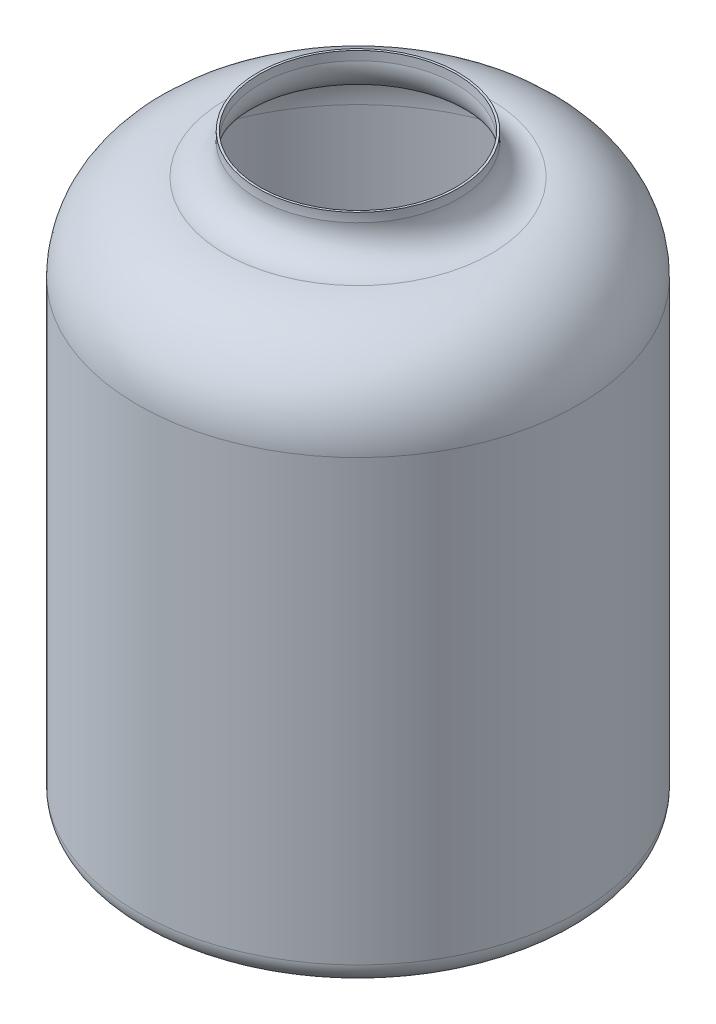
ISO-10303-21;
HEADER;
FILE_DESCRIPTION(('STEP AP214'),'2;1');
FILE_NAME('part.step','',(''),(''),'','','');
FILE_SCHEMA(('AUTOMOTIVE_DESIGN { 1 0 10303 214 1 1 1 1 }'));
ENDSEC;
DATA;
#1=APPLICATION_CONTEXT('core data for automotive mechanical design processes');
#2=APPLICATION_PROTOCOL_DEFINITION('international standard','automotive_design',2000,#1);
#3=PRODUCT_CONTEXT('',#1,'mechanical');
#4=PRODUCT('Part','Part','',(#3));
#5=PRODUCT_RELATED_PRODUCT_CATEGORY('part','',(#4));
#6=PRODUCT_DEFINITION_FORMATION('','',#4);
#7=PRODUCT_DEFINITION_CONTEXT('part definition',#1,'design');
#8=PRODUCT_DEFINITION('design','',#6,#7);
#9=PRODUCT_DEFINITION_SHAPE('','',#8);
#10=(LENGTH_UNIT() NAMED_UNIT(*) SI_UNIT(.MILLI.,.METRE.));
#11=(NAMED_UNIT(*) PLANE_ANGLE_UNIT() SI_UNIT($,.RADIAN.));
#12=(NAMED_UNIT(*) SI_UNIT($,.STERADIAN.) SOLID_ANGLE_UNIT());
#13=UNCERTAINTY_MEASURE_WITH_UNIT(LENGTH_MEASURE(1.E-05),#10,'distance_accuracy_value','');
#14=(GEOMETRIC_REPRESENTATION_CONTEXT(3) GLOBAL_UNCERTAINTY_ASSIGNED_CONTEXT((#13)) GLOBAL_UNIT_ASSIGNED_CONTEXT((#10,
#11,#12)) REPRESENTATION_CONTEXT('',''));
#15=CARTESIAN_POINT('',(0.,0.,0.));
#16=DIRECTION('',(0.,0.,1.));
#17=DIRECTION('',(1.,0.,0.));
#18=AXIS2_PLACEMENT_3D('',#15,#16,#17);
#19=CARTESIAN_POINT('',(46.,270.,0.));
#20=CARTESIAN_POINT('',(45.8436696307465,267.804686779506,0.));
#21=CARTESIAN_POINT('',(46.,265.865364012421,0.));
#22=B_SPLINE_CURVE_WITH_KNOTS('',2,(#19,#20,#21),.UNSPECIFIED.,.F.,.F.,(3,3),(0.,
0.134328339219714),.UNSPECIFIED.);
#23=CARTESIAN_POINT('',(0.,1.,0.));
#24=DIRECTION('',(0.,-1.,0.));
#25=AXIS1_PLACEMENT('',#23,#24);
#26=SURFACE_OF_REVOLUTION('',#22,#25);
#27=CARTESIAN_POINT('',(0.,265.865364012421,0.));
#28=DIRECTION('',(0.,-1.,0.));
#29=DIRECTION('',(0.,0.,-1.));
#30=AXIS2_PLACEMENT_3D('',#27,#28,#29);
#31=CIRCLE('',#30,46.);
#32=CARTESIAN_POINT('',(0.,265.865364012421,-46.));
#33=VERTEX_POINT('',#32);
#34=EDGE_CURVE('E95',#33,#33,#31,.T.);
#35=ORIENTED_EDGE('',*,*,#34,.F.);
#36=EDGE_LOOP('',(#35));
#37=FACE_BOUND('',#36,.T.);
#38=CARTESIAN_POINT('',(0.,270.,0.));
#39=DIRECTION('',(0.,-1.,0.));
#40=DIRECTION('',(0.,0.,-1.));
#41=AXIS2_PLACEMENT_3D('',#38,#39,#40);
#42=CIRCLE('',#41,46.);
#43=CARTESIAN_POINT('',(0.,270.,-46.));
#44=VERTEX_POINT('',#43);
#45=EDGE_CURVE('E10',#44,#44,#42,.T.);
#46=ORIENTED_EDGE('',*,*,#45,.T.);
#47=EDGE_LOOP('',(#46));
#48=FACE_BOUND('',#47,.T.);
#49=ADVANCED_FACE('F39',(#37,#48),#26,.T.);
#50=CARTESIAN_POINT('',(0.,270.,0.));
#51=DIRECTION('',(0.,1.,0.));
#52=DIRECTION('',(0.,0.,1.));
#53=AXIS2_PLACEMENT_3D('',#50,#51,#52);
#54=PLANE('',#53);
#55=CARTESIAN_POINT('',(0.,270.,0.));
#56=DIRECTION('',(0.,-1.,0.));
#57=DIRECTION('',(0.,0.,-1.));
#58=AXIS2_PLACEMENT_3D('',#55,#56,#57);
#59=CIRCLE('',#58,45.);
#60=CARTESIAN_POINT('',(0.,270.,-45.));
#61=VERTEX_POINT('',#60);
#62=EDGE_CURVE('E47',#61,#61,#59,.T.);
#63=ORIENTED_EDGE('',*,*,#62,.T.);
#64=EDGE_LOOP('',(#63));
#65=FACE_BOUND('',#64,.T.);
#66=ORIENTED_EDGE('',*,*,#45,.F.);
#67=EDGE_LOOP('',(#66));
#68=FACE_BOUND('',#67,.T.);
#69=ADVANCED_FACE('F109',(#65,#68),#54,.T.);
#70=CARTESIAN_POINT('',(0.,1.,0.));
#71=DIRECTION('',(0.,-1.,0.));
#72=DIRECTION('',(0.,0.,-1.));
#73=AXIS2_PLACEMENT_3D('',#70,#71,#72);
#74=CYLINDRICAL_SURFACE('',#73,45.);
#75=CARTESIAN_POINT('',(0.,265.865364012421,0.));
#76=DIRECTION('',(0.,-1.,0.));
#77=DIRECTION('',(0.,0.,-1.));
#78=AXIS2_PLACEMENT_3D('',#75,#76,#77);
#79=CIRCLE('',#78,45.);
#80=CARTESIAN_POINT('',(0.,265.865364012421,-45.));
#81=VERTEX_POINT('',#80);
#82=EDGE_CURVE('E52',#81,#81,#79,.T.);
#83=ORIENTED_EDGE('',*,*,#82,.T.);
#84=EDGE_LOOP('',(#83));
#85=FACE_BOUND('',#84,.T.);
#86=ORIENTED_EDGE('',*,*,#62,.F.);
#87=EDGE_LOOP('',(#86));
#88=FACE_BOUND('',#87,.T.);
#89=ADVANCED_FACE('F113',(#85,#88),#74,.F.);
#90=CARTESIAN_POINT('',(0.,264.197729964427,0.));
#91=DIRECTION('',(0.,-1.,0.));
#92=DIRECTION('',(0.,0.,-1.));
#93=AXIS2_PLACEMENT_3D('',#90,#91,#92);
#94=TOROIDAL_SURFACE('',#93,59.6036309840676,14.6985387449518);
#95=CARTESIAN_POINT('',(0.,249.594098980359,0.));
#96=DIRECTION('',(0.,-1.,0.));
#97=DIRECTION('',(0.,0.,-1.));
#98=AXIS2_PLACEMENT_3D('',#95,#96,#97);
#99=CIRCLE('',#98,57.9359969360737);
#100=CARTESIAN_POINT('',(0.,249.594098980359,-57.9359969360737));
#101=VERTEX_POINT('',#100);
#102=EDGE_CURVE('E57',#101,#101,#99,.T.);
#103=ORIENTED_EDGE('',*,*,#102,.T.);
#104=EDGE_LOOP('',(#103));
#105=FACE_BOUND('',#104,.T.);
#106=ORIENTED_EDGE('',*,*,#82,.F.);
#107=EDGE_LOOP('',(#106));
#108=FACE_BOUND('',#107,.T.);
#109=ADVANCED_FACE('F117',(#105,#108),#94,.T.);
#110=CARTESIAN_POINT('',(0.,249.594098980359,0.));
#111=DIRECTION('',(0.,-1.,0.));
#112=DIRECTION('',(0.,0.,-1.));
#113=AXIS2_PLACEMENT_3D('',#110,#111,#112);
#114=PLANE('',#113);
#115=CARTESIAN_POINT('',(0.,249.594098980359,0.));
#116=DIRECTION('',(0.,-1.,0.));
#117=DIRECTION('',(0.,0.,-1.));
#118=AXIS2_PLACEMENT_3D('',#115,#116,#117);
#119=CIRCLE('',#118,60.);
#120=CARTESIAN_POINT('',(0.,249.594098980359,-60.));
#121=VERTEX_POINT('',#120);
#122=EDGE_CURVE('E63',#121,#121,#119,.T.);
#123=ORIENTED_EDGE('',*,*,#122,.T.);
#124=EDGE_LOOP('',(#123));
#125=FACE_BOUND('',#124,.T.);
#126=ORIENTED_EDGE('',*,*,#102,.F.);
#127=EDGE_LOOP('',(#126));
#128=FACE_BOUND('',#127,.T.);
#129=ADVANCED_FACE('F124',(#125,#128),#114,.T.);
#130=CARTESIAN_POINT('',(0.,209.594098980359,0.));
#131=DIRECTION('',(0.,-1.,0.));
#132=DIRECTION('',(0.,0.,-1.));
#133=AXIS2_PLACEMENT_3D('',#130,#131,#132);
#134=TOROIDAL_SURFACE('',#133,60.,40.);
#135=CARTESIAN_POINT('',(0.,209.594098980359,0.));
#136=DIRECTION('',(0.,-1.,0.));
#137=DIRECTION('',(0.,0.,-1.));
#138=AXIS2_PLACEMENT_3D('',#135,#136,#137);
#139=CIRCLE('',#138,100.);
#140=CARTESIAN_POINT('',(0.,209.594098980359,-100.));
#141=VERTEX_POINT('',#140);
#142=EDGE_CURVE('E67',#141,#141,#139,.T.);
#143=ORIENTED_EDGE('',*,*,#142,.T.);
#144=EDGE_LOOP('',(#143));
#145=FACE_BOUND('',#144,.T.);
#146=ORIENTED_EDGE('',*,*,#122,.F.);
#147=EDGE_LOOP('',(#146));
#148=FACE_BOUND('',#147,.T.);
#149=ADVANCED_FACE('F128',(#145,#148),#134,.F.);
#150=CARTESIAN_POINT('',(0.,1.,0.));
#151=DIRECTION('',(0.,-1.,0.));
#152=DIRECTION('',(0.,0.,-1.));
#153=AXIS2_PLACEMENT_3D('',#150,#151,#152);
#154=CYLINDRICAL_SURFACE('',#153,100.);
#155=CARTESIAN_POINT('',(0.,11.,0.));
#156=DIRECTION('',(0.,-1.,0.));
#157=DIRECTION('',(0.,0.,-1.));
#158=AXIS2_PLACEMENT_3D('',#155,#156,#157);
#159=CIRCLE('',#158,100.);
#160=CARTESIAN_POINT('',(0.,11.,-100.));
#161=VERTEX_POINT('',#160);
#162=EDGE_CURVE('E71',#161,#161,#159,.T.);
#163=ORIENTED_EDGE('',*,*,#162,.T.);
#164=EDGE_LOOP('',(#163));
#165=FACE_BOUND('',#164,.T.);
#166=ORIENTED_EDGE('',*,*,#142,.F.);
#167=EDGE_LOOP('',(#166));
#168=FACE_BOUND('',#167,.T.);
#169=ADVANCED_FACE('F132',(#165,#168),#154,.F.);
#170=CARTESIAN_POINT('',(0.,11.,0.));
#171=DIRECTION('',(0.,-1.,0.));
#172=DIRECTION('',(0.,0.,-1.));
#173=AXIS2_PLACEMENT_3D('',#170,#171,#172);
#174=TOROIDAL_SURFACE('',#173,90.,10.);
#175=ORIENTED_EDGE('',*,*,#162,.F.);
#176=EDGE_LOOP('',(#175));
#177=FACE_BOUND('',#176,.T.);
#178=CARTESIAN_POINT('',(0.,1.,0.));
#179=DIRECTION('',(0.,-1.,0.));
#180=DIRECTION('',(0.,0.,-1.));
#181=AXIS2_PLACEMENT_3D('',#178,#179,#180);
#182=CIRCLE('',#181,90.);
#183=CARTESIAN_POINT('',(0.,1.,-90.));
#184=VERTEX_POINT('',#183);
#185=EDGE_CURVE('E75',#184,#184,#182,.T.);
#186=ORIENTED_EDGE('',*,*,#185,.T.);
#187=EDGE_LOOP('',(#186));
#188=FACE_BOUND('',#187,.T.);
#189=ADVANCED_FACE('F136',(#177,#188),#174,.F.);
#190=CARTESIAN_POINT('',(0.,1.,0.));
#191=DIRECTION('',(0.,-1.,0.));
#192=DIRECTION('',(0.,0.,-1.));
#193=AXIS2_PLACEMENT_3D('',#190,#191,#192);
#194=PLANE('',#193);
#195=ORIENTED_EDGE('',*,*,#185,.F.);
#196=EDGE_LOOP('',(#195));
#197=FACE_BOUND('',#196,.T.);
#198=ADVANCED_FACE('F140',(#197),#194,.F.);
#199=CARTESIAN_POINT('',(0.,0.,0.));
#200=DIRECTION('',(0.,1.,0.));
#201=DIRECTION('',(0.,0.,1.));
#202=AXIS2_PLACEMENT_3D('',#199,#200,#201);
#203=PLANE('',#202);
#204=CARTESIAN_POINT('',(0.,0.,0.));
#205=DIRECTION('',(0.,-1.,0.));
#206=DIRECTION('',(0.,0.,-1.));
#207=AXIS2_PLACEMENT_3D('',#204,#205,#206);
#208=CIRCLE('',#207,91.);
#209=CARTESIAN_POINT('',(0.,0.,-91.));
#210=VERTEX_POINT('',#209);
#211=EDGE_CURVE('E79',#210,#210,#208,.T.);
#212=ORIENTED_EDGE('',*,*,#211,.T.);
#213=EDGE_LOOP('',(#212));
#214=FACE_BOUND('',#213,.T.);
#215=ADVANCED_FACE('F144',(#214),#203,.F.);
#216=CARTESIAN_POINT('',(0.,10.,0.));
#217=DIRECTION('',(0.,-1.,0.));
#218=DIRECTION('',(0.,0.,-1.));
#219=AXIS2_PLACEMENT_3D('',#216,#217,#218);
#220=TOROIDAL_SURFACE('',#219,91.,10.);
#221=CARTESIAN_POINT('',(0.,10.,0.));
#222=DIRECTION('',(0.,-1.,0.));
#223=DIRECTION('',(0.,0.,-1.));
#224=AXIS2_PLACEMENT_3D('',#221,#222,#223);
#225=CIRCLE('',#224,101.);
#226=CARTESIAN_POINT('',(0.,10.,-101.));
#227=VERTEX_POINT('',#226);
#228=EDGE_CURVE('E83',#227,#227,#225,.T.);
#229=ORIENTED_EDGE('',*,*,#228,.T.);
#230=EDGE_LOOP('',(#229));
#231=FACE_BOUND('',#230,.T.);
#232=ORIENTED_EDGE('',*,*,#211,.F.);
#233=EDGE_LOOP('',(#232));
#234=FACE_BOUND('',#233,.T.);
#235=ADVANCED_FACE('F148',(#231,#234),#220,.T.);
#236=CARTESIAN_POINT('',(0.,1.,0.));
#237=DIRECTION('',(0.,-1.,0.));
#238=DIRECTION('',(0.,0.,-1.));
#239=AXIS2_PLACEMENT_3D('',#236,#237,#238);
#240=CYLINDRICAL_SURFACE('',#239,101.);
#241=CARTESIAN_POINT('',(0.,211.501152495448,0.));
#242=DIRECTION('',(0.,-1.,0.));
#243=DIRECTION('',(0.,0.,-1.));
#244=AXIS2_PLACEMENT_3D('',#241,#242,#243);
#245=CIRCLE('',#244,101.);
#246=CARTESIAN_POINT('',(0.,211.501152495448,-101.));
#247=VERTEX_POINT('',#246);
#248=EDGE_CURVE('E87',#247,#247,#245,.T.);
#249=ORIENTED_EDGE('',*,*,#248,.T.);
#250=EDGE_LOOP('',(#249));
#251=FACE_BOUND('',#250,.T.);
#252=ORIENTED_EDGE('',*,*,#228,.F.);
#253=EDGE_LOOP('',(#252));
#254=FACE_BOUND('',#253,.T.);
#255=ADVANCED_FACE('F152',(#251,#254),#240,.T.);
#256=CARTESIAN_POINT('',(0.,211.501152495448,0.));
#257=DIRECTION('',(0.,-1.,0.));
#258=DIRECTION('',(0.,0.,-1.));
#259=AXIS2_PLACEMENT_3D('',#256,#257,#258);
#260=TOROIDAL_SURFACE('',#259,61.,40.);
#261=CARTESIAN_POINT('',(0.,251.501152495448,0.));
#262=DIRECTION('',(0.,-1.,0.));
#263=DIRECTION('',(0.,0.,-1.));
#264=AXIS2_PLACEMENT_3D('',#261,#262,#263);
#265=CIRCLE('',#264,61.);
#266=CARTESIAN_POINT('',(0.,251.501152495448,-61.));
#267=VERTEX_POINT('',#266);
#268=EDGE_CURVE('E91',#267,#267,#265,.T.);
#269=ORIENTED_EDGE('',*,*,#268,.T.);
#270=EDGE_LOOP('',(#269));
#271=FACE_BOUND('',#270,.T.);
#272=ORIENTED_EDGE('',*,*,#248,.F.);
#273=EDGE_LOOP('',(#272));
#274=FACE_BOUND('',#273,.T.);
#275=ADVANCED_FACE('F156',(#271,#274),#260,.T.);
#276=CARTESIAN_POINT('',(0.,265.168467083308,0.));
#277=DIRECTION('',(0.,-1.,0.));
#278=DIRECTION('',(0.,0.,-1.));
#279=AXIS2_PLACEMENT_3D('',#276,#277,#278);
#280=TOROIDAL_SURFACE('',#279,59.7103274237904,13.728027658675);
#281=ORIENTED_EDGE('',*,*,#268,.F.);
#282=EDGE_LOOP('',(#281));
#283=FACE_BOUND('',#282,.T.);
#284=ORIENTED_EDGE('',*,*,#34,.T.);
#285=EDGE_LOOP('',(#284));
#286=FACE_BOUND('',#285,.T.);
#287=ADVANCED_FACE('F106',(#283,#286),#280,.F.);
#288=CLOSED_SHELL('',(#49,#69,#89,#109,#129,#149,#169,#189,#198,#215,#235,#255,#275,#287));
#289=MANIFOLD_SOLID_BREP('B2',#288);
#290=ADVANCED_BREP_SHAPE_REPRESENTATION('',(#18,#289),#14);
#291=SHAPE_DEFINITION_REPRESENTATION(#9,#290);
ENDSEC;
END-ISO-10303-21;
